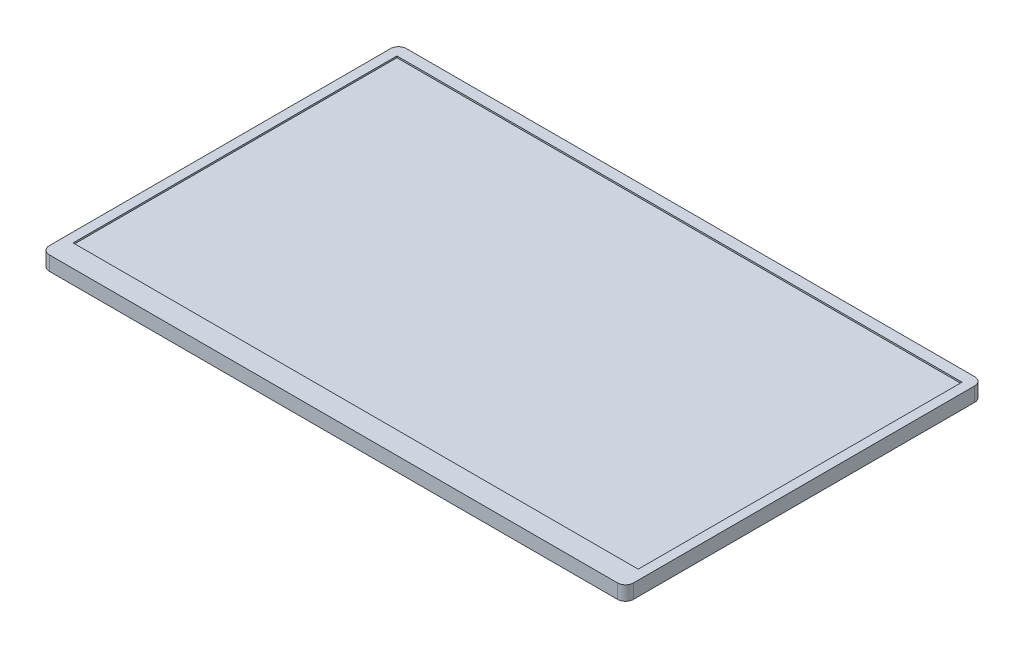
ISO-10303-21;
HEADER;
FILE_DESCRIPTION(('STEP AP214'),'2;1');
FILE_NAME('part.step','',(''),(''),'','','');
FILE_SCHEMA(('AUTOMOTIVE_DESIGN { 1 0 10303 214 1 1 1 1 }'));
ENDSEC;
DATA;
#1=APPLICATION_CONTEXT('core data for automotive mechanical design processes');
#2=APPLICATION_PROTOCOL_DEFINITION('international standard','automotive_design',2000,#1);
#3=PRODUCT_CONTEXT('',#1,'mechanical');
#4=PRODUCT('Part','Part','',(#3));
#5=PRODUCT_RELATED_PRODUCT_CATEGORY('part','',(#4));
#6=PRODUCT_DEFINITION_FORMATION('','',#4);
#7=PRODUCT_DEFINITION_CONTEXT('part definition',#1,'design');
#8=PRODUCT_DEFINITION('design','',#6,#7);
#9=PRODUCT_DEFINITION_SHAPE('','',#8);
#10=(LENGTH_UNIT() NAMED_UNIT(*) SI_UNIT(.MILLI.,.METRE.));
#11=(NAMED_UNIT(*) PLANE_ANGLE_UNIT() SI_UNIT($,.RADIAN.));
#12=(NAMED_UNIT(*) SI_UNIT($,.STERADIAN.) SOLID_ANGLE_UNIT());
#13=UNCERTAINTY_MEASURE_WITH_UNIT(LENGTH_MEASURE(1.E-05),#10,'distance_accuracy_value','');
#14=(GEOMETRIC_REPRESENTATION_CONTEXT(3) GLOBAL_UNCERTAINTY_ASSIGNED_CONTEXT((#13)) GLOBAL_UNIT_ASSIGNED_CONTEXT((#10,
#11,#12)) REPRESENTATION_CONTEXT('',''));
#15=CARTESIAN_POINT('',(0.,0.,0.));
#16=DIRECTION('',(0.,0.,1.));
#17=DIRECTION('',(1.,0.,0.));
#18=AXIS2_PLACEMENT_3D('',#15,#16,#17);
#19=CARTESIAN_POINT('',(-184.,9.,-112.5));
#20=DIRECTION('',(1.,0.,0.));
#21=DIRECTION('',(0.,0.,-1.));
#22=AXIS2_PLACEMENT_3D('',#19,#20,#21);
#23=PLANE('',#22);
#24=DIRECTION('',(0.,0.,1.));
#25=VECTOR('',#24,1.);
#26=CARTESIAN_POINT('',(-184.,0.,-112.5));
#27=LINE('',#26,#25);
#28=CARTESIAN_POINT('',(-184.,0.,-107.5));
#29=VERTEX_POINT('',#28);
#30=CARTESIAN_POINT('',(-184.,0.,107.5));
#31=VERTEX_POINT('',#30);
#32=EDGE_CURVE('E173',#29,#31,#27,.T.);
#33=ORIENTED_EDGE('',*,*,#32,.T.);
#34=DIRECTION('',(0.,-1.,0.));
#35=VECTOR('',#34,1.);
#36=CARTESIAN_POINT('',(-184.,9.,107.5));
#37=LINE('',#36,#35);
#38=CARTESIAN_POINT('',(-184.,9.,107.5));
#39=VERTEX_POINT('',#38);
#40=EDGE_CURVE('E250',#31,#39,#37,.F.);
#41=ORIENTED_EDGE('',*,*,#40,.T.);
#42=DIRECTION('',(0.,0.,1.));
#43=VECTOR('',#42,1.);
#44=CARTESIAN_POINT('',(-184.,9.,-112.5));
#45=LINE('',#44,#43);
#46=CARTESIAN_POINT('',(-184.,9.,-107.5));
#47=VERTEX_POINT('',#46);
#48=EDGE_CURVE('E179',#47,#39,#45,.T.);
#49=ORIENTED_EDGE('',*,*,#48,.F.);
#50=DIRECTION('',(0.,-1.,0.));
#51=VECTOR('',#50,1.);
#52=CARTESIAN_POINT('',(-184.,9.,-107.5));
#53=LINE('',#52,#51);
#54=EDGE_CURVE('E246',#47,#29,#53,.T.);
#55=ORIENTED_EDGE('',*,*,#54,.T.);
#56=EDGE_LOOP('',(#33,#41,#49,#55));
#57=FACE_BOUND('',#56,.T.);
#58=ADVANCED_FACE('F38',(#57),#23,.F.);
#59=CARTESIAN_POINT('',(-184.,9.,112.5));
#60=DIRECTION('',(0.,0.,-1.));
#61=DIRECTION('',(-1.,0.,0.));
#62=AXIS2_PLACEMENT_3D('',#59,#60,#61);
#63=PLANE('',#62);
#64=DIRECTION('',(1.,0.,0.));
#65=VECTOR('',#64,1.);
#66=CARTESIAN_POINT('',(-184.,0.,112.5));
#67=LINE('',#66,#65);
#68=CARTESIAN_POINT('',(-179.,0.,112.5));
#69=VERTEX_POINT('',#68);
#70=CARTESIAN_POINT('',(179.,0.,112.5));
#71=VERTEX_POINT('',#70);
#72=EDGE_CURVE('E199',#69,#71,#67,.T.);
#73=ORIENTED_EDGE('',*,*,#72,.T.);
#74=DIRECTION('',(0.,-1.,0.));
#75=VECTOR('',#74,1.);
#76=CARTESIAN_POINT('',(179.,9.,112.5));
#77=LINE('',#76,#75);
#78=CARTESIAN_POINT('',(179.,9.,112.5));
#79=VERTEX_POINT('',#78);
#80=EDGE_CURVE('E231',#71,#79,#77,.F.);
#81=ORIENTED_EDGE('',*,*,#80,.T.);
#82=DIRECTION('',(1.,0.,0.));
#83=VECTOR('',#82,1.);
#84=CARTESIAN_POINT('',(-184.,9.,112.5));
#85=LINE('',#84,#83);
#86=CARTESIAN_POINT('',(-179.,9.,112.5));
#87=VERTEX_POINT('',#86);
#88=EDGE_CURVE('E183',#87,#79,#85,.T.);
#89=ORIENTED_EDGE('',*,*,#88,.F.);
#90=DIRECTION('',(0.,-1.,0.));
#91=VECTOR('',#90,1.);
#92=CARTESIAN_POINT('',(-179.,9.,112.5));
#93=LINE('',#92,#91);
#94=EDGE_CURVE('E227',#87,#69,#93,.T.);
#95=ORIENTED_EDGE('',*,*,#94,.T.);
#96=EDGE_LOOP('',(#73,#81,#89,#95));
#97=FACE_BOUND('',#96,.T.);
#98=ADVANCED_FACE('F279',(#97),#63,.F.);
#99=CARTESIAN_POINT('',(184.,9.,-112.5));
#100=DIRECTION('',(-1.,0.,0.));
#101=DIRECTION('',(0.,0.,1.));
#102=AXIS2_PLACEMENT_3D('',#99,#100,#101);
#103=PLANE('',#102);
#104=DIRECTION('',(0.,0.,-1.));
#105=VECTOR('',#104,1.);
#106=CARTESIAN_POINT('',(184.,9.,-112.5));
#107=LINE('',#106,#105);
#108=CARTESIAN_POINT('',(184.,9.,107.5));
#109=VERTEX_POINT('',#108);
#110=CARTESIAN_POINT('',(184.,9.,-107.5));
#111=VERTEX_POINT('',#110);
#112=EDGE_CURVE('E188',#109,#111,#107,.T.);
#113=ORIENTED_EDGE('',*,*,#112,.F.);
#114=DIRECTION('',(0.,-1.,0.));
#115=VECTOR('',#114,1.);
#116=CARTESIAN_POINT('',(184.,9.,107.5));
#117=LINE('',#116,#115);
#118=CARTESIAN_POINT('',(184.,0.,107.5));
#119=VERTEX_POINT('',#118);
#120=EDGE_CURVE('E211',#109,#119,#117,.T.);
#121=ORIENTED_EDGE('',*,*,#120,.T.);
#122=DIRECTION('',(0.,0.,-1.));
#123=VECTOR('',#122,1.);
#124=CARTESIAN_POINT('',(184.,0.,-112.5));
#125=LINE('',#124,#123);
#126=CARTESIAN_POINT('',(184.,0.,-107.5));
#127=VERTEX_POINT('',#126);
#128=EDGE_CURVE('E203',#119,#127,#125,.T.);
#129=ORIENTED_EDGE('',*,*,#128,.T.);
#130=DIRECTION('',(0.,-1.,0.));
#131=VECTOR('',#130,1.);
#132=CARTESIAN_POINT('',(184.,9.,-107.5));
#133=LINE('',#132,#131);
#134=EDGE_CURVE('E195',#127,#111,#133,.F.);
#135=ORIENTED_EDGE('',*,*,#134,.T.);
#136=EDGE_LOOP('',(#113,#121,#129,#135));
#137=FACE_BOUND('',#136,.T.);
#138=ADVANCED_FACE('F287',(#137),#103,.F.);
#139=CARTESIAN_POINT('',(-184.,9.,-112.5));
#140=DIRECTION('',(0.,0.,1.));
#141=DIRECTION('',(1.,0.,0.));
#142=AXIS2_PLACEMENT_3D('',#139,#140,#141);
#143=PLANE('',#142);
#144=DIRECTION('',(-1.,0.,0.));
#145=VECTOR('',#144,1.);
#146=CARTESIAN_POINT('',(-184.,0.,-112.5));
#147=LINE('',#146,#145);
#148=CARTESIAN_POINT('',(179.,0.,-112.5));
#149=VERTEX_POINT('',#148);
#150=CARTESIAN_POINT('',(-179.,0.,-112.5));
#151=VERTEX_POINT('',#150);
#152=EDGE_CURVE('E184',#149,#151,#147,.T.);
#153=ORIENTED_EDGE('',*,*,#152,.T.);
#154=DIRECTION('',(0.,-1.,0.));
#155=VECTOR('',#154,1.);
#156=CARTESIAN_POINT('',(-179.,9.,-112.5));
#157=LINE('',#156,#155);
#158=CARTESIAN_POINT('',(-179.,9.,-112.5));
#159=VERTEX_POINT('',#158);
#160=EDGE_CURVE('E11',#151,#159,#157,.F.);
#161=ORIENTED_EDGE('',*,*,#160,.T.);
#162=DIRECTION('',(-1.,0.,0.));
#163=VECTOR('',#162,1.);
#164=CARTESIAN_POINT('',(-184.,9.,-112.5));
#165=LINE('',#164,#163);
#166=CARTESIAN_POINT('',(179.,9.,-112.5));
#167=VERTEX_POINT('',#166);
#168=EDGE_CURVE('E192',#167,#159,#165,.T.);
#169=ORIENTED_EDGE('',*,*,#168,.F.);
#170=DIRECTION('',(0.,-1.,0.));
#171=VECTOR('',#170,1.);
#172=CARTESIAN_POINT('',(179.,9.,-112.5));
#173=LINE('',#172,#171);
#174=EDGE_CURVE('E47',#167,#149,#173,.T.);
#175=ORIENTED_EDGE('',*,*,#174,.T.);
#176=EDGE_LOOP('',(#153,#161,#169,#175));
#177=FACE_BOUND('',#176,.T.);
#178=ADVANCED_FACE('F256',(#177),#143,.F.);
#179=CARTESIAN_POINT('',(0.,9.,0.));
#180=DIRECTION('',(0.,1.,0.));
#181=DIRECTION('',(0.,0.,1.));
#182=AXIS2_PLACEMENT_3D('',#179,#180,#181);
#183=PLANE('',#182);
#184=DIRECTION('',(0.,0.,1.));
#185=VECTOR('',#184,1.);
#186=CARTESIAN_POINT('',(-178.,9.,-105.5));
#187=LINE('',#186,#185);
#188=CARTESIAN_POINT('',(-178.,9.,-105.5));
#189=VERTEX_POINT('',#188);
#190=CARTESIAN_POINT('',(-178.,9.,98.5));
#191=VERTEX_POINT('',#190);
#192=EDGE_CURVE('E54',#189,#191,#187,.T.);
#193=ORIENTED_EDGE('',*,*,#192,.F.);
#194=DIRECTION('',(-1.,0.,0.));
#195=VECTOR('',#194,1.);
#196=CARTESIAN_POINT('',(-178.,9.,-105.5));
#197=LINE('',#196,#195);
#198=CARTESIAN_POINT('',(178.,9.,-105.5));
#199=VERTEX_POINT('',#198);
#200=EDGE_CURVE('E151',#199,#189,#197,.T.);
#201=ORIENTED_EDGE('',*,*,#200,.F.);
#202=DIRECTION('',(0.,0.,-1.));
#203=VECTOR('',#202,1.);
#204=CARTESIAN_POINT('',(178.,9.,-105.5));
#205=LINE('',#204,#203);
#206=CARTESIAN_POINT('',(178.,9.,98.5));
#207=VERTEX_POINT('',#206);
#208=EDGE_CURVE('E155',#207,#199,#205,.T.);
#209=ORIENTED_EDGE('',*,*,#208,.F.);
#210=DIRECTION('',(1.,0.,0.));
#211=VECTOR('',#210,1.);
#212=CARTESIAN_POINT('',(-178.,9.,98.5));
#213=LINE('',#212,#211);
#214=EDGE_CURVE('E164',#191,#207,#213,.T.);
#215=ORIENTED_EDGE('',*,*,#214,.F.);
#216=EDGE_LOOP('',(#193,#201,#209,#215));
#217=FACE_BOUND('',#216,.T.);
#218=ORIENTED_EDGE('',*,*,#88,.T.);
#219=CARTESIAN_POINT('',(179.,9.,107.5));
#220=DIRECTION('',(0.,1.,0.));
#221=DIRECTION('',(0.,0.,1.));
#222=AXIS2_PLACEMENT_3D('',#219,#220,#221);
#223=CIRCLE('',#222,5.);
#224=EDGE_CURVE('E243',#79,#109,#223,.T.);
#225=ORIENTED_EDGE('',*,*,#224,.T.);
#226=ORIENTED_EDGE('',*,*,#112,.T.);
#227=CARTESIAN_POINT('',(179.,9.,-107.5));
#228=DIRECTION('',(0.,1.,0.));
#229=DIRECTION('',(0.,0.,1.));
#230=AXIS2_PLACEMENT_3D('',#227,#228,#229);
#231=CIRCLE('',#230,5.);
#232=EDGE_CURVE('E234',#111,#167,#231,.T.);
#233=ORIENTED_EDGE('',*,*,#232,.T.);
#234=ORIENTED_EDGE('',*,*,#168,.T.);
#235=CARTESIAN_POINT('',(-179.,9.,-107.5));
#236=DIRECTION('',(0.,1.,0.));
#237=DIRECTION('',(0.,0.,1.));
#238=AXIS2_PLACEMENT_3D('',#235,#236,#237);
#239=CIRCLE('',#238,5.);
#240=EDGE_CURVE('E237',#159,#47,#239,.T.);
#241=ORIENTED_EDGE('',*,*,#240,.T.);
#242=ORIENTED_EDGE('',*,*,#48,.T.);
#243=CARTESIAN_POINT('',(-179.,9.,107.5));
#244=DIRECTION('',(0.,1.,0.));
#245=DIRECTION('',(0.,0.,1.));
#246=AXIS2_PLACEMENT_3D('',#243,#244,#245);
#247=CIRCLE('',#246,5.);
#248=EDGE_CURVE('E240',#39,#87,#247,.T.);
#249=ORIENTED_EDGE('',*,*,#248,.T.);
#250=EDGE_LOOP('',(#218,#225,#226,#233,#234,#241,#242,#249));
#251=FACE_BOUND('',#250,.T.);
#252=ADVANCED_FACE('F272',(#217,#251),#183,.T.);
#253=CARTESIAN_POINT('',(0.,0.,0.));
#254=DIRECTION('',(0.,1.,0.));
#255=DIRECTION('',(0.,0.,1.));
#256=AXIS2_PLACEMENT_3D('',#253,#254,#255);
#257=PLANE('',#256);
#258=ORIENTED_EDGE('',*,*,#128,.F.);
#259=CARTESIAN_POINT('',(179.,0.,107.5));
#260=DIRECTION('',(0.,1.,0.));
#261=DIRECTION('',(0.,0.,1.));
#262=AXIS2_PLACEMENT_3D('',#259,#260,#261);
#263=CIRCLE('',#262,5.);
#264=EDGE_CURVE('E224',#119,#71,#263,.F.);
#265=ORIENTED_EDGE('',*,*,#264,.T.);
#266=ORIENTED_EDGE('',*,*,#72,.F.);
#267=CARTESIAN_POINT('',(-179.,0.,107.5));
#268=DIRECTION('',(0.,1.,0.));
#269=DIRECTION('',(0.,0.,1.));
#270=AXIS2_PLACEMENT_3D('',#267,#268,#269);
#271=CIRCLE('',#270,5.);
#272=EDGE_CURVE('E221',#69,#31,#271,.F.);
#273=ORIENTED_EDGE('',*,*,#272,.T.);
#274=ORIENTED_EDGE('',*,*,#32,.F.);
#275=CARTESIAN_POINT('',(-179.,0.,-107.5));
#276=DIRECTION('',(0.,1.,0.));
#277=DIRECTION('',(0.,0.,1.));
#278=AXIS2_PLACEMENT_3D('',#275,#276,#277);
#279=CIRCLE('',#278,5.);
#280=EDGE_CURVE('E218',#29,#151,#279,.F.);
#281=ORIENTED_EDGE('',*,*,#280,.T.);
#282=ORIENTED_EDGE('',*,*,#152,.F.);
#283=CARTESIAN_POINT('',(179.,0.,-107.5));
#284=DIRECTION('',(0.,1.,0.));
#285=DIRECTION('',(0.,0.,1.));
#286=AXIS2_PLACEMENT_3D('',#283,#284,#285);
#287=CIRCLE('',#286,5.);
#288=EDGE_CURVE('E215',#149,#127,#287,.F.);
#289=ORIENTED_EDGE('',*,*,#288,.T.);
#290=EDGE_LOOP('',(#258,#265,#266,#273,#274,#281,#282,#289));
#291=FACE_BOUND('',#290,.T.);
#292=ADVANCED_FACE('F261',(#291),#257,.F.);
#293=CARTESIAN_POINT('',(179.,9.,107.5));
#294=DIRECTION('',(0.,-1.,0.));
#295=DIRECTION('',(0.,0.,-1.));
#296=AXIS2_PLACEMENT_3D('',#293,#294,#295);
#297=CYLINDRICAL_SURFACE('',#296,5.);
#298=ORIENTED_EDGE('',*,*,#224,.F.);
#299=ORIENTED_EDGE('',*,*,#80,.F.);
#300=ORIENTED_EDGE('',*,*,#264,.F.);
#301=ORIENTED_EDGE('',*,*,#120,.F.);
#302=EDGE_LOOP('',(#298,#299,#300,#301));
#303=FACE_BOUND('',#302,.T.);
#304=ADVANCED_FACE('F284',(#303),#297,.T.);
#305=CARTESIAN_POINT('',(-179.,9.,107.5));
#306=DIRECTION('',(0.,-1.,0.));
#307=DIRECTION('',(0.,0.,-1.));
#308=AXIS2_PLACEMENT_3D('',#305,#306,#307);
#309=CYLINDRICAL_SURFACE('',#308,5.);
#310=ORIENTED_EDGE('',*,*,#248,.F.);
#311=ORIENTED_EDGE('',*,*,#40,.F.);
#312=ORIENTED_EDGE('',*,*,#272,.F.);
#313=ORIENTED_EDGE('',*,*,#94,.F.);
#314=EDGE_LOOP('',(#310,#311,#312,#313));
#315=FACE_BOUND('',#314,.T.);
#316=ADVANCED_FACE('F276',(#315),#309,.T.);
#317=CARTESIAN_POINT('',(-179.,9.,-107.5));
#318=DIRECTION('',(0.,-1.,0.));
#319=DIRECTION('',(0.,0.,-1.));
#320=AXIS2_PLACEMENT_3D('',#317,#318,#319);
#321=CYLINDRICAL_SURFACE('',#320,5.);
#322=ORIENTED_EDGE('',*,*,#240,.F.);
#323=ORIENTED_EDGE('',*,*,#160,.F.);
#324=ORIENTED_EDGE('',*,*,#280,.F.);
#325=ORIENTED_EDGE('',*,*,#54,.F.);
#326=EDGE_LOOP('',(#322,#323,#324,#325));
#327=FACE_BOUND('',#326,.T.);
#328=ADVANCED_FACE('F266',(#327),#321,.T.);
#329=CARTESIAN_POINT('',(179.,9.,-107.5));
#330=DIRECTION('',(0.,-1.,0.));
#331=DIRECTION('',(0.,0.,-1.));
#332=AXIS2_PLACEMENT_3D('',#329,#330,#331);
#333=CYLINDRICAL_SURFACE('',#332,5.);
#334=ORIENTED_EDGE('',*,*,#232,.F.);
#335=ORIENTED_EDGE('',*,*,#134,.F.);
#336=ORIENTED_EDGE('',*,*,#288,.F.);
#337=ORIENTED_EDGE('',*,*,#174,.F.);
#338=EDGE_LOOP('',(#334,#335,#336,#337));
#339=FACE_BOUND('',#338,.T.);
#340=ADVANCED_FACE('F40',(#339),#333,.T.);
#341=CARTESIAN_POINT('',(-178.,8.,-105.5));
#342=DIRECTION('',(-1.,0.,0.));
#343=DIRECTION('',(0.,0.,1.));
#344=AXIS2_PLACEMENT_3D('',#341,#342,#343);
#345=PLANE('',#344);
#346=ORIENTED_EDGE('',*,*,#192,.T.);
#347=DIRECTION('',(0.,1.,0.));
#348=VECTOR('',#347,1.);
#349=CARTESIAN_POINT('',(-178.,8.,98.5));
#350=LINE('',#349,#348);
#351=CARTESIAN_POINT('',(-178.,8.,98.5));
#352=VERTEX_POINT('',#351);
#353=EDGE_CURVE('E126',#352,#191,#350,.T.);
#354=ORIENTED_EDGE('',*,*,#353,.F.);
#355=DIRECTION('',(0.,0.,1.));
#356=VECTOR('',#355,1.);
#357=CARTESIAN_POINT('',(-178.,8.,-105.5));
#358=LINE('',#357,#356);
#359=CARTESIAN_POINT('',(-178.,8.,-105.5));
#360=VERTEX_POINT('',#359);
#361=EDGE_CURVE('E130',#360,#352,#358,.T.);
#362=ORIENTED_EDGE('',*,*,#361,.F.);
#363=DIRECTION('',(0.,1.,0.));
#364=VECTOR('',#363,1.);
#365=CARTESIAN_POINT('',(-178.,8.,-105.5));
#366=LINE('',#365,#364);
#367=EDGE_CURVE('E170',#360,#189,#366,.T.);
#368=ORIENTED_EDGE('',*,*,#367,.T.);
#369=EDGE_LOOP('',(#346,#354,#362,#368));
#370=FACE_BOUND('',#369,.T.);
#371=ADVANCED_FACE('F128',(#370),#345,.F.);
#372=CARTESIAN_POINT('',(-178.,8.,-105.5));
#373=DIRECTION('',(0.,0.,-1.));
#374=DIRECTION('',(-1.,0.,0.));
#375=AXIS2_PLACEMENT_3D('',#372,#373,#374);
#376=PLANE('',#375);
#377=ORIENTED_EDGE('',*,*,#200,.T.);
#378=ORIENTED_EDGE('',*,*,#367,.F.);
#379=DIRECTION('',(-1.,0.,0.));
#380=VECTOR('',#379,1.);
#381=CARTESIAN_POINT('',(-178.,8.,-105.5));
#382=LINE('',#381,#380);
#383=CARTESIAN_POINT('',(178.,8.,-105.5));
#384=VERTEX_POINT('',#383);
#385=EDGE_CURVE('E137',#384,#360,#382,.T.);
#386=ORIENTED_EDGE('',*,*,#385,.F.);
#387=DIRECTION('',(0.,1.,0.));
#388=VECTOR('',#387,1.);
#389=CARTESIAN_POINT('',(178.,8.,-105.5));
#390=LINE('',#389,#388);
#391=EDGE_CURVE('E174',#384,#199,#390,.T.);
#392=ORIENTED_EDGE('',*,*,#391,.T.);
#393=EDGE_LOOP('',(#377,#378,#386,#392));
#394=FACE_BOUND('',#393,.T.);
#395=ADVANCED_FACE('F294',(#394),#376,.F.);
#396=CARTESIAN_POINT('',(178.,8.,-105.5));
#397=DIRECTION('',(1.,0.,0.));
#398=DIRECTION('',(0.,0.,-1.));
#399=AXIS2_PLACEMENT_3D('',#396,#397,#398);
#400=PLANE('',#399);
#401=ORIENTED_EDGE('',*,*,#208,.T.);
#402=ORIENTED_EDGE('',*,*,#391,.F.);
#403=DIRECTION('',(0.,0.,-1.));
#404=VECTOR('',#403,1.);
#405=CARTESIAN_POINT('',(178.,8.,-105.5));
#406=LINE('',#405,#404);
#407=CARTESIAN_POINT('',(178.,8.,98.5));
#408=VERTEX_POINT('',#407);
#409=EDGE_CURVE('E146',#408,#384,#406,.T.);
#410=ORIENTED_EDGE('',*,*,#409,.F.);
#411=DIRECTION('',(0.,1.,0.));
#412=VECTOR('',#411,1.);
#413=CARTESIAN_POINT('',(178.,8.,98.5));
#414=LINE('',#413,#412);
#415=EDGE_CURVE('E136',#408,#207,#414,.T.);
#416=ORIENTED_EDGE('',*,*,#415,.T.);
#417=EDGE_LOOP('',(#401,#402,#410,#416));
#418=FACE_BOUND('',#417,.T.);
#419=ADVANCED_FACE('F343',(#418),#400,.F.);
#420=CARTESIAN_POINT('',(-178.,8.,98.5));
#421=DIRECTION('',(0.,0.,1.));
#422=DIRECTION('',(1.,0.,0.));
#423=AXIS2_PLACEMENT_3D('',#420,#421,#422);
#424=PLANE('',#423);
#425=ORIENTED_EDGE('',*,*,#214,.T.);
#426=ORIENTED_EDGE('',*,*,#415,.F.);
#427=DIRECTION('',(1.,0.,0.));
#428=VECTOR('',#427,1.);
#429=CARTESIAN_POINT('',(-178.,8.,98.5));
#430=LINE('',#429,#428);
#431=EDGE_CURVE('E140',#352,#408,#430,.T.);
#432=ORIENTED_EDGE('',*,*,#431,.F.);
#433=ORIENTED_EDGE('',*,*,#353,.T.);
#434=EDGE_LOOP('',(#425,#426,#432,#433));
#435=FACE_BOUND('',#434,.T.);
#436=ADVANCED_FACE('F141',(#435),#424,.F.);
#437=CARTESIAN_POINT('',(0.,8.,0.));
#438=DIRECTION('',(0.,1.,0.));
#439=DIRECTION('',(0.,0.,1.));
#440=AXIS2_PLACEMENT_3D('',#437,#438,#439);
#441=PLANE('',#440);
#442=ORIENTED_EDGE('',*,*,#361,.T.);
#443=ORIENTED_EDGE('',*,*,#431,.T.);
#444=ORIENTED_EDGE('',*,*,#409,.T.);
#445=ORIENTED_EDGE('',*,*,#385,.T.);
#446=EDGE_LOOP('',(#442,#443,#444,#445));
#447=FACE_BOUND('',#446,.T.);
#448=ADVANCED_FACE('F148',(#447),#441,.T.);
#449=CLOSED_SHELL('',(#58,#98,#138,#178,#252,#292,#304,#316,#328,#340,#371,#395,#419,#436,#448));
#450=MANIFOLD_SOLID_BREP('B2',#449);
#451=ADVANCED_BREP_SHAPE_REPRESENTATION('',(#18,#450),#14);
#452=SHAPE_DEFINITION_REPRESENTATION(#9,#451);
ENDSEC;
END-ISO-10303-21;
